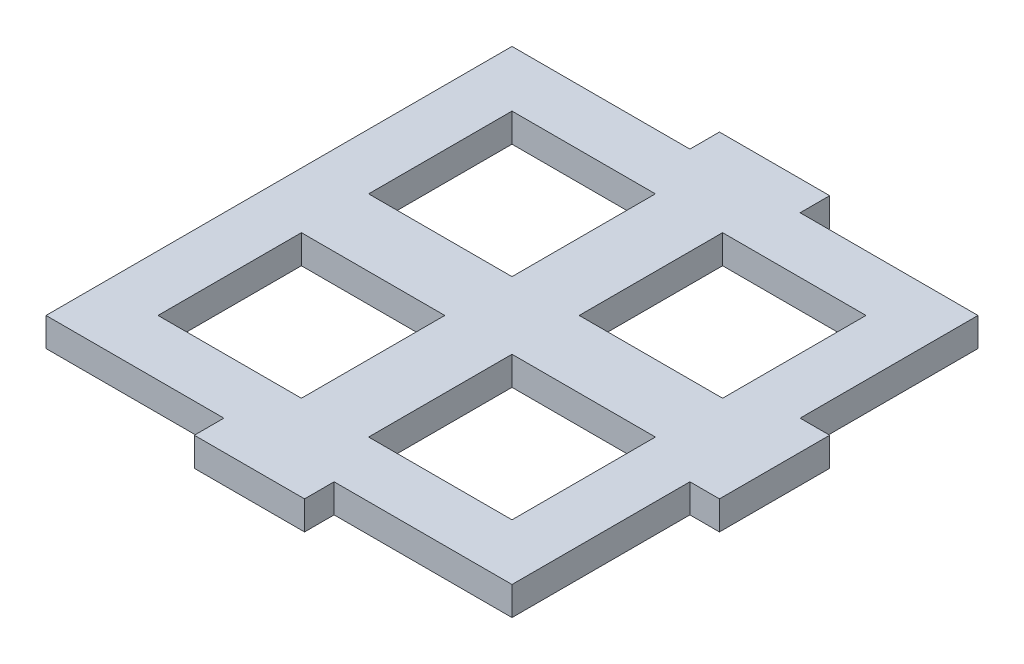
ISO-10303-21;
HEADER;
FILE_DESCRIPTION(('STEP AP214'),'2;1');
FILE_NAME('part.step','',(''),(''),'','','');
FILE_SCHEMA(('AUTOMOTIVE_DESIGN { 1 0 10303 214 1 1 1 1 }'));
ENDSEC;
DATA;
#1=APPLICATION_CONTEXT('core data for automotive mechanical design processes');
#2=APPLICATION_PROTOCOL_DEFINITION('international standard','automotive_design',2000,#1);
#3=PRODUCT_CONTEXT('',#1,'mechanical');
#4=PRODUCT('Part','Part','',(#3));
#5=PRODUCT_RELATED_PRODUCT_CATEGORY('part','',(#4));
#6=PRODUCT_DEFINITION_FORMATION('','',#4);
#7=PRODUCT_DEFINITION_CONTEXT('part definition',#1,'design');
#8=PRODUCT_DEFINITION('design','',#6,#7);
#9=PRODUCT_DEFINITION_SHAPE('','',#8);
#10=(LENGTH_UNIT() NAMED_UNIT(*) SI_UNIT(.MILLI.,.METRE.));
#11=(NAMED_UNIT(*) PLANE_ANGLE_UNIT() SI_UNIT($,.RADIAN.));
#12=(NAMED_UNIT(*) SI_UNIT($,.STERADIAN.) SOLID_ANGLE_UNIT());
#13=UNCERTAINTY_MEASURE_WITH_UNIT(LENGTH_MEASURE(1.E-05),#10,'distance_accuracy_value','');
#14=(GEOMETRIC_REPRESENTATION_CONTEXT(3) GLOBAL_UNCERTAINTY_ASSIGNED_CONTEXT((#13)) GLOBAL_UNIT_ASSIGNED_CONTEXT((#10,
#11,#12)) REPRESENTATION_CONTEXT('',''));
#15=CARTESIAN_POINT('',(0.,0.,0.));
#16=DIRECTION('',(0.,0.,1.));
#17=DIRECTION('',(1.,0.,0.));
#18=AXIS2_PLACEMENT_3D('',#15,#16,#17);
#19=CARTESIAN_POINT('',(21.016,0.,152.654));
#20=DIRECTION('',(0.,0.,1.));
#21=DIRECTION('',(1.,0.,0.));
#22=AXIS2_PLACEMENT_3D('',#19,#20,#21);
#23=PLANE('',#22);
#24=DIRECTION('',(1.,0.,0.));
#25=VECTOR('',#24,1.);
#26=CARTESIAN_POINT('',(21.016,4.064,152.654));
#27=LINE('',#26,#25);
#28=CARTESIAN_POINT('',(61.8464999999999,4.064,152.654));
#29=VERTEX_POINT('',#28);
#30=CARTESIAN_POINT('',(87.056,4.064,152.654));
#31=VERTEX_POINT('',#30);
#32=EDGE_CURVE('E478',#29,#31,#27,.T.);
#33=ORIENTED_EDGE('',*,*,#32,.F.);
#34=DIRECTION('',(0.,-1.,0.));
#35=VECTOR('',#34,1.);
#36=CARTESIAN_POINT('',(61.8464999999999,20.2374387809148,152.654));
#37=LINE('',#36,#35);
#38=CARTESIAN_POINT('',(61.8465,0.,152.654));
#39=VERTEX_POINT('',#38);
#40=EDGE_CURVE('E278',#29,#39,#37,.T.);
#41=ORIENTED_EDGE('',*,*,#40,.T.);
#42=DIRECTION('',(1.,0.,0.));
#43=VECTOR('',#42,1.);
#44=CARTESIAN_POINT('',(21.016,0.,152.654));
#45=LINE('',#44,#43);
#46=CARTESIAN_POINT('',(87.056,0.,152.654));
#47=VERTEX_POINT('',#46);
#48=EDGE_CURVE('E464',#39,#47,#45,.T.);
#49=ORIENTED_EDGE('',*,*,#48,.T.);
#50=DIRECTION('',(0.,1.,0.));
#51=VECTOR('',#50,1.);
#52=CARTESIAN_POINT('',(87.056,0.,152.654));
#53=LINE('',#52,#51);
#54=EDGE_CURVE('E488',#47,#31,#53,.T.);
#55=ORIENTED_EDGE('',*,*,#54,.T.);
#56=EDGE_LOOP('',(#33,#41,#49,#55));
#57=FACE_BOUND('',#56,.T.);
#58=ADVANCED_FACE('F34',(#57),#23,.T.);
#59=CARTESIAN_POINT('',(21.016,0.,86.614));
#60=DIRECTION('',(0.,0.,-1.));
#61=DIRECTION('',(-1.,0.,0.));
#62=AXIS2_PLACEMENT_3D('',#59,#60,#61);
#63=PLANE('',#62);
#64=DIRECTION('',(-1.,0.,0.));
#65=VECTOR('',#64,1.);
#66=CARTESIAN_POINT('',(21.016,4.064,86.614));
#67=LINE('',#66,#65);
#68=CARTESIAN_POINT('',(46.2255,4.064,86.614));
#69=VERTEX_POINT('',#68);
#70=CARTESIAN_POINT('',(21.016,4.064,86.614));
#71=VERTEX_POINT('',#70);
#72=EDGE_CURVE('E484',#69,#71,#67,.T.);
#73=ORIENTED_EDGE('',*,*,#72,.F.);
#74=DIRECTION('',(0.,-1.,0.));
#75=VECTOR('',#74,1.);
#76=CARTESIAN_POINT('',(46.2255,20.2374387809148,86.614));
#77=LINE('',#76,#75);
#78=CARTESIAN_POINT('',(46.2255,0.,86.614));
#79=VERTEX_POINT('',#78);
#80=EDGE_CURVE('E287',#69,#79,#77,.T.);
#81=ORIENTED_EDGE('',*,*,#80,.T.);
#82=DIRECTION('',(-1.,0.,0.));
#83=VECTOR('',#82,1.);
#84=CARTESIAN_POINT('',(21.016,0.,86.614));
#85=LINE('',#84,#83);
#86=CARTESIAN_POINT('',(21.016,0.,86.614));
#87=VERTEX_POINT('',#86);
#88=EDGE_CURVE('E473',#79,#87,#85,.T.);
#89=ORIENTED_EDGE('',*,*,#88,.T.);
#90=DIRECTION('',(0.,1.,0.));
#91=VECTOR('',#90,1.);
#92=CARTESIAN_POINT('',(21.016,0.,86.614));
#93=LINE('',#92,#91);
#94=EDGE_CURVE('E11',#87,#71,#93,.T.);
#95=ORIENTED_EDGE('',*,*,#94,.T.);
#96=EDGE_LOOP('',(#73,#81,#89,#95));
#97=FACE_BOUND('',#96,.T.);
#98=ADVANCED_FACE('F503',(#97),#63,.T.);
#99=CARTESIAN_POINT('',(87.056,0.,86.614));
#100=DIRECTION('',(1.,0.,0.));
#101=DIRECTION('',(0.,0.,-1.));
#102=AXIS2_PLACEMENT_3D('',#99,#100,#101);
#103=PLANE('',#102);
#104=DIRECTION('',(0.,0.,-1.));
#105=VECTOR('',#104,1.);
#106=CARTESIAN_POINT('',(87.056,4.064,86.614));
#107=LINE('',#106,#105);
#108=CARTESIAN_POINT('',(87.0559999999999,4.064,111.8235));
#109=VERTEX_POINT('',#108);
#110=CARTESIAN_POINT('',(87.056,4.064,86.614));
#111=VERTEX_POINT('',#110);
#112=EDGE_CURVE('E480',#109,#111,#107,.T.);
#113=ORIENTED_EDGE('',*,*,#112,.F.);
#114=DIRECTION('',(0.,-1.,0.));
#115=VECTOR('',#114,1.);
#116=CARTESIAN_POINT('',(87.0559999999999,20.2374387809148,111.8235));
#117=LINE('',#116,#115);
#118=CARTESIAN_POINT('',(87.056,0.,111.8235));
#119=VERTEX_POINT('',#118);
#120=EDGE_CURVE('E326',#109,#119,#117,.T.);
#121=ORIENTED_EDGE('',*,*,#120,.T.);
#122=DIRECTION('',(0.,0.,-1.));
#123=VECTOR('',#122,1.);
#124=CARTESIAN_POINT('',(87.056,0.,86.614));
#125=LINE('',#124,#123);
#126=CARTESIAN_POINT('',(87.056,0.,86.614));
#127=VERTEX_POINT('',#126);
#128=EDGE_CURVE('E469',#119,#127,#125,.T.);
#129=ORIENTED_EDGE('',*,*,#128,.T.);
#130=DIRECTION('',(0.,1.,0.));
#131=VECTOR('',#130,1.);
#132=CARTESIAN_POINT('',(87.056,0.,86.614));
#133=LINE('',#132,#131);
#134=EDGE_CURVE('E43',#127,#111,#133,.T.);
#135=ORIENTED_EDGE('',*,*,#134,.T.);
#136=EDGE_LOOP('',(#113,#121,#129,#135));
#137=FACE_BOUND('',#136,.T.);
#138=ADVANCED_FACE('F523',(#137),#103,.T.);
#139=CARTESIAN_POINT('',(21.016,0.,86.614));
#140=DIRECTION('',(-1.,0.,0.));
#141=DIRECTION('',(0.,0.,1.));
#142=AXIS2_PLACEMENT_3D('',#139,#140,#141);
#143=PLANE('',#142);
#144=DIRECTION('',(0.,0.,1.));
#145=VECTOR('',#144,1.);
#146=CARTESIAN_POINT('',(21.016,4.064,86.614));
#147=LINE('',#146,#145);
#148=CARTESIAN_POINT('',(21.016,4.064,152.654));
#149=VERTEX_POINT('',#148);
#150=EDGE_CURVE('E454',#71,#149,#147,.T.);
#151=ORIENTED_EDGE('',*,*,#150,.F.);
#152=ORIENTED_EDGE('',*,*,#94,.F.);
#153=DIRECTION('',(0.,0.,1.));
#154=VECTOR('',#153,1.);
#155=CARTESIAN_POINT('',(21.016,0.,86.614));
#156=LINE('',#155,#154);
#157=CARTESIAN_POINT('',(21.016,0.,152.654));
#158=VERTEX_POINT('',#157);
#159=EDGE_CURVE('E461',#87,#158,#156,.T.);
#160=ORIENTED_EDGE('',*,*,#159,.T.);
#161=DIRECTION('',(0.,1.,0.));
#162=VECTOR('',#161,1.);
#163=CARTESIAN_POINT('',(21.016,0.,152.654));
#164=LINE('',#163,#162);
#165=EDGE_CURVE('E38',#158,#149,#164,.T.);
#166=ORIENTED_EDGE('',*,*,#165,.T.);
#167=EDGE_LOOP('',(#151,#152,#160,#166));
#168=FACE_BOUND('',#167,.T.);
#169=ADVANCED_FACE('F36',(#168),#143,.T.);
#170=DIRECTION('',(0.,-1.,0.));
#171=VECTOR('',#170,1.);
#172=CARTESIAN_POINT('',(61.8465,20.2374387809148,86.614));
#173=LINE('',#172,#171);
#174=CARTESIAN_POINT('',(61.8465,4.064,86.614));
#175=VERTEX_POINT('',#174);
#176=CARTESIAN_POINT('',(61.8465,0.,86.614));
#177=VERTEX_POINT('',#176);
#178=EDGE_CURVE('E293',#175,#177,#173,.T.);
#179=ORIENTED_EDGE('',*,*,#178,.F.);
#180=EDGE_CURVE('E465',#111,#175,#67,.T.);
#181=ORIENTED_EDGE('',*,*,#180,.F.);
#182=ORIENTED_EDGE('',*,*,#134,.F.);
#183=EDGE_CURVE('E474',#127,#177,#85,.T.);
#184=ORIENTED_EDGE('',*,*,#183,.T.);
#185=EDGE_LOOP('',(#179,#181,#182,#184));
#186=FACE_BOUND('',#185,.T.);
#187=ADVANCED_FACE('F525',(#186),#63,.T.);
#188=DIRECTION('',(0.,-1.,0.));
#189=VECTOR('',#188,1.);
#190=CARTESIAN_POINT('',(87.0559999999999,20.2374387809148,127.4445));
#191=LINE('',#190,#189);
#192=CARTESIAN_POINT('',(87.0559999999999,4.064,127.4445));
#193=VERTEX_POINT('',#192);
#194=CARTESIAN_POINT('',(87.0559999999999,0.,127.4445));
#195=VERTEX_POINT('',#194);
#196=EDGE_CURVE('E317',#193,#195,#191,.T.);
#197=ORIENTED_EDGE('',*,*,#196,.F.);
#198=EDGE_CURVE('E481',#31,#193,#107,.T.);
#199=ORIENTED_EDGE('',*,*,#198,.F.);
#200=ORIENTED_EDGE('',*,*,#54,.F.);
#201=EDGE_CURVE('E470',#47,#195,#125,.T.);
#202=ORIENTED_EDGE('',*,*,#201,.T.);
#203=EDGE_LOOP('',(#197,#199,#200,#202));
#204=FACE_BOUND('',#203,.T.);
#205=ADVANCED_FACE('F511',(#204),#103,.T.);
#206=DIRECTION('',(0.,-1.,0.));
#207=VECTOR('',#206,1.);
#208=CARTESIAN_POINT('',(46.2255,20.2374387809148,152.654));
#209=LINE('',#208,#207);
#210=CARTESIAN_POINT('',(46.2255,4.064,152.654));
#211=VERTEX_POINT('',#210);
#212=CARTESIAN_POINT('',(46.2255,0.,152.654));
#213=VERTEX_POINT('',#212);
#214=EDGE_CURVE('E257',#211,#213,#209,.T.);
#215=ORIENTED_EDGE('',*,*,#214,.F.);
#216=EDGE_CURVE('E254',#149,#211,#27,.T.);
#217=ORIENTED_EDGE('',*,*,#216,.F.);
#218=ORIENTED_EDGE('',*,*,#165,.F.);
#219=EDGE_CURVE('E466',#158,#213,#45,.T.);
#220=ORIENTED_EDGE('',*,*,#219,.T.);
#221=EDGE_LOOP('',(#215,#217,#218,#220));
#222=FACE_BOUND('',#221,.T.);
#223=ADVANCED_FACE('F500',(#222),#23,.T.);
#224=CARTESIAN_POINT('',(0.,0.,0.));
#225=DIRECTION('',(0.,1.,0.));
#226=DIRECTION('',(0.,0.,1.));
#227=AXIS2_PLACEMENT_3D('',#224,#225,#226);
#228=PLANE('',#227);
#229=DIRECTION('',(1.,0.,0.));
#230=VECTOR('',#229,1.);
#231=CARTESIAN_POINT('',(58.7984999999999,0.,144.7165));
#232=LINE('',#231,#230);
#233=CARTESIAN_POINT('',(58.7984999999999,0.,144.7165));
#234=VERTEX_POINT('',#233);
#235=CARTESIAN_POINT('',(79.1185,0.,144.7165));
#236=VERTEX_POINT('',#235);
#237=EDGE_CURVE('E343',#234,#236,#232,.T.);
#238=ORIENTED_EDGE('',*,*,#237,.T.);
#239=DIRECTION('',(0.,0.,-1.));
#240=VECTOR('',#239,1.);
#241=CARTESIAN_POINT('',(79.1184999999999,0.,124.3965));
#242=LINE('',#241,#240);
#243=CARTESIAN_POINT('',(79.1184999999999,0.,124.3965));
#244=VERTEX_POINT('',#243);
#245=EDGE_CURVE('E333',#236,#244,#242,.T.);
#246=ORIENTED_EDGE('',*,*,#245,.T.);
#247=DIRECTION('',(-1.,0.,0.));
#248=VECTOR('',#247,1.);
#249=CARTESIAN_POINT('',(58.7984999999999,0.,124.3965));
#250=LINE('',#249,#248);
#251=CARTESIAN_POINT('',(58.7984999999999,0.,124.3965));
#252=VERTEX_POINT('',#251);
#253=EDGE_CURVE('E336',#244,#252,#250,.T.);
#254=ORIENTED_EDGE('',*,*,#253,.T.);
#255=DIRECTION('',(0.,0.,1.));
#256=VECTOR('',#255,1.);
#257=CARTESIAN_POINT('',(58.7984999999999,0.,124.3965));
#258=LINE('',#257,#256);
#259=EDGE_CURVE('E340',#252,#234,#258,.T.);
#260=ORIENTED_EDGE('',*,*,#259,.T.);
#261=EDGE_LOOP('',(#238,#246,#254,#260));
#262=FACE_BOUND('',#261,.T.);
#263=DIRECTION('',(1.,0.,0.));
#264=VECTOR('',#263,1.);
#265=CARTESIAN_POINT('',(28.9534999999999,0.,144.7165));
#266=LINE('',#265,#264);
#267=CARTESIAN_POINT('',(28.9534999999999,0.,144.7165));
#268=VERTEX_POINT('',#267);
#269=CARTESIAN_POINT('',(49.2735,0.,144.7165));
#270=VERTEX_POINT('',#269);
#271=EDGE_CURVE('E375',#268,#270,#266,.T.);
#272=ORIENTED_EDGE('',*,*,#271,.T.);
#273=DIRECTION('',(0.,0.,-1.));
#274=VECTOR('',#273,1.);
#275=CARTESIAN_POINT('',(49.2734999999999,0.,124.3965));
#276=LINE('',#275,#274);
#277=CARTESIAN_POINT('',(49.2734999999999,0.,124.3965));
#278=VERTEX_POINT('',#277);
#279=EDGE_CURVE('E365',#270,#278,#276,.T.);
#280=ORIENTED_EDGE('',*,*,#279,.T.);
#281=DIRECTION('',(-1.,0.,0.));
#282=VECTOR('',#281,1.);
#283=CARTESIAN_POINT('',(28.9534999999999,0.,124.3965));
#284=LINE('',#283,#282);
#285=CARTESIAN_POINT('',(28.9534999999999,0.,124.3965));
#286=VERTEX_POINT('',#285);
#287=EDGE_CURVE('E368',#278,#286,#284,.T.);
#288=ORIENTED_EDGE('',*,*,#287,.T.);
#289=DIRECTION('',(0.,0.,1.));
#290=VECTOR('',#289,1.);
#291=CARTESIAN_POINT('',(28.9534999999999,0.,124.3965));
#292=LINE('',#291,#290);
#293=EDGE_CURVE('E372',#286,#268,#292,.T.);
#294=ORIENTED_EDGE('',*,*,#293,.T.);
#295=EDGE_LOOP('',(#272,#280,#288,#294));
#296=FACE_BOUND('',#295,.T.);
#297=DIRECTION('',(1.,0.,0.));
#298=VECTOR('',#297,1.);
#299=CARTESIAN_POINT('',(58.7984999999999,0.,114.8715));
#300=LINE('',#299,#298);
#301=CARTESIAN_POINT('',(58.7984999999999,0.,114.8715));
#302=VERTEX_POINT('',#301);
#303=CARTESIAN_POINT('',(79.1184999999999,0.,114.8715));
#304=VERTEX_POINT('',#303);
#305=EDGE_CURVE('E407',#302,#304,#300,.T.);
#306=ORIENTED_EDGE('',*,*,#305,.T.);
#307=DIRECTION('',(0.,0.,-1.));
#308=VECTOR('',#307,1.);
#309=CARTESIAN_POINT('',(79.1184999999999,0.,94.5514999999999));
#310=LINE('',#309,#308);
#311=CARTESIAN_POINT('',(79.1184999999999,0.,94.5514999999999));
#312=VERTEX_POINT('',#311);
#313=EDGE_CURVE('E397',#304,#312,#310,.T.);
#314=ORIENTED_EDGE('',*,*,#313,.T.);
#315=DIRECTION('',(-1.,0.,0.));
#316=VECTOR('',#315,1.);
#317=CARTESIAN_POINT('',(58.7984999999999,0.,94.5514999999999));
#318=LINE('',#317,#316);
#319=CARTESIAN_POINT('',(58.7984999999999,0.,94.5514999999999));
#320=VERTEX_POINT('',#319);
#321=EDGE_CURVE('E400',#312,#320,#318,.T.);
#322=ORIENTED_EDGE('',*,*,#321,.T.);
#323=DIRECTION('',(0.,0.,1.));
#324=VECTOR('',#323,1.);
#325=CARTESIAN_POINT('',(58.7984999999999,0.,94.5514999999999));
#326=LINE('',#325,#324);
#327=EDGE_CURVE('E404',#320,#302,#326,.T.);
#328=ORIENTED_EDGE('',*,*,#327,.T.);
#329=EDGE_LOOP('',(#306,#314,#322,#328));
#330=FACE_BOUND('',#329,.T.);
#331=DIRECTION('',(-1.,0.,0.));
#332=VECTOR('',#331,1.);
#333=CARTESIAN_POINT('',(49.2734999999999,0.,94.5514999999999));
#334=LINE('',#333,#332);
#335=CARTESIAN_POINT('',(49.2734999999999,0.,94.5514999999999));
#336=VERTEX_POINT('',#335);
#337=CARTESIAN_POINT('',(28.9534999999999,0.,94.5514999999999));
#338=VERTEX_POINT('',#337);
#339=EDGE_CURVE('E439',#336,#338,#334,.T.);
#340=ORIENTED_EDGE('',*,*,#339,.T.);
#341=DIRECTION('',(0.,0.,1.));
#342=VECTOR('',#341,1.);
#343=CARTESIAN_POINT('',(28.9534999999999,0.,94.5514999999999));
#344=LINE('',#343,#342);
#345=CARTESIAN_POINT('',(28.9534999999999,0.,114.8715));
#346=VERTEX_POINT('',#345);
#347=EDGE_CURVE('E429',#338,#346,#344,.T.);
#348=ORIENTED_EDGE('',*,*,#347,.T.);
#349=DIRECTION('',(1.,0.,0.));
#350=VECTOR('',#349,1.);
#351=CARTESIAN_POINT('',(49.2734999999999,0.,114.8715));
#352=LINE('',#351,#350);
#353=CARTESIAN_POINT('',(49.2734999999999,0.,114.8715));
#354=VERTEX_POINT('',#353);
#355=EDGE_CURVE('E432',#346,#354,#352,.T.);
#356=ORIENTED_EDGE('',*,*,#355,.T.);
#357=DIRECTION('',(0.,0.,-1.));
#358=VECTOR('',#357,1.);
#359=CARTESIAN_POINT('',(49.2734999999999,0.,94.5514999999999));
#360=LINE('',#359,#358);
#361=EDGE_CURVE('E436',#354,#336,#360,.T.);
#362=ORIENTED_EDGE('',*,*,#361,.T.);
#363=EDGE_LOOP('',(#340,#348,#356,#362));
#364=FACE_BOUND('',#363,.T.);
#365=ORIENTED_EDGE('',*,*,#159,.F.);
#366=ORIENTED_EDGE('',*,*,#88,.F.);
#367=DIRECTION('',(0.,0.,-1.));
#368=VECTOR('',#367,1.);
#369=CARTESIAN_POINT('',(46.2255,0.,82.423));
#370=LINE('',#369,#368);
#371=CARTESIAN_POINT('',(46.2255,0.,82.423));
#372=VERTEX_POINT('',#371);
#373=EDGE_CURVE('E59',#79,#372,#370,.T.);
#374=ORIENTED_EDGE('',*,*,#373,.T.);
#375=DIRECTION('',(1.,0.,0.));
#376=VECTOR('',#375,1.);
#377=CARTESIAN_POINT('',(61.8465,0.,82.423));
#378=LINE('',#377,#376);
#379=CARTESIAN_POINT('',(61.8465,0.,82.423));
#380=VERTEX_POINT('',#379);
#381=EDGE_CURVE('E284',#372,#380,#378,.T.);
#382=ORIENTED_EDGE('',*,*,#381,.T.);
#383=DIRECTION('',(0.,0.,1.));
#384=VECTOR('',#383,1.);
#385=CARTESIAN_POINT('',(61.8465,0.,82.423));
#386=LINE('',#385,#384);
#387=EDGE_CURVE('E283',#380,#177,#386,.T.);
#388=ORIENTED_EDGE('',*,*,#387,.T.);
#389=ORIENTED_EDGE('',*,*,#183,.F.);
#390=ORIENTED_EDGE('',*,*,#128,.F.);
#391=DIRECTION('',(1.,0.,0.));
#392=VECTOR('',#391,1.);
#393=CARTESIAN_POINT('',(91.2469999999999,0.,111.8235));
#394=LINE('',#393,#392);
#395=CARTESIAN_POINT('',(91.2469999999999,0.,111.8235));
#396=VERTEX_POINT('',#395);
#397=EDGE_CURVE('E307',#119,#396,#394,.T.);
#398=ORIENTED_EDGE('',*,*,#397,.T.);
#399=DIRECTION('',(0.,0.,1.));
#400=VECTOR('',#399,1.);
#401=CARTESIAN_POINT('',(91.2469999999999,0.,111.8235));
#402=LINE('',#401,#400);
#403=CARTESIAN_POINT('',(91.2469999999999,0.,127.4445));
#404=VERTEX_POINT('',#403);
#405=EDGE_CURVE('E306',#396,#404,#402,.T.);
#406=ORIENTED_EDGE('',*,*,#405,.T.);
#407=DIRECTION('',(-1.,0.,0.));
#408=VECTOR('',#407,1.);
#409=CARTESIAN_POINT('',(91.2469999999999,0.,127.4445));
#410=LINE('',#409,#408);
#411=EDGE_CURVE('E311',#404,#195,#410,.T.);
#412=ORIENTED_EDGE('',*,*,#411,.T.);
#413=ORIENTED_EDGE('',*,*,#201,.F.);
#414=ORIENTED_EDGE('',*,*,#48,.F.);
#415=DIRECTION('',(0.,0.,1.));
#416=VECTOR('',#415,1.);
#417=CARTESIAN_POINT('',(61.8464999999999,0.,152.654));
#418=LINE('',#417,#416);
#419=CARTESIAN_POINT('',(61.8465,0.,156.845));
#420=VERTEX_POINT('',#419);
#421=EDGE_CURVE('E51',#39,#420,#418,.T.);
#422=ORIENTED_EDGE('',*,*,#421,.T.);
#423=DIRECTION('',(-1.,0.,0.));
#424=VECTOR('',#423,1.);
#425=CARTESIAN_POINT('',(61.8465,0.,156.845));
#426=LINE('',#425,#424);
#427=CARTESIAN_POINT('',(46.2255,0.,156.845));
#428=VERTEX_POINT('',#427);
#429=EDGE_CURVE('E272',#420,#428,#426,.T.);
#430=ORIENTED_EDGE('',*,*,#429,.T.);
#431=DIRECTION('',(0.,0.,-1.));
#432=VECTOR('',#431,1.);
#433=CARTESIAN_POINT('',(46.2255,0.,152.654));
#434=LINE('',#433,#432);
#435=EDGE_CURVE('E263',#428,#213,#434,.T.);
#436=ORIENTED_EDGE('',*,*,#435,.T.);
#437=ORIENTED_EDGE('',*,*,#219,.F.);
#438=EDGE_LOOP('',(#365,#366,#374,#382,#388,#389,#390,#398,#406,#412,#413,#414,#422,#430,#436,#437));
#439=FACE_BOUND('',#438,.T.);
#440=ADVANCED_FACE('F506',(#262,#296,#330,#364,#439),#228,.F.);
#441=CARTESIAN_POINT('',(0.,4.064,0.));
#442=DIRECTION('',(0.,1.,0.));
#443=DIRECTION('',(0.,0.,1.));
#444=AXIS2_PLACEMENT_3D('',#441,#442,#443);
#445=PLANE('',#444);
#446=DIRECTION('',(0.,0.,-1.));
#447=VECTOR('',#446,1.);
#448=CARTESIAN_POINT('',(79.1184999999999,4.064,124.3965));
#449=LINE('',#448,#447);
#450=CARTESIAN_POINT('',(79.1185,4.064,144.7165));
#451=VERTEX_POINT('',#450);
#452=CARTESIAN_POINT('',(79.1184999999999,4.064,124.3965));
#453=VERTEX_POINT('',#452);
#454=EDGE_CURVE('E332',#451,#453,#449,.T.);
#455=ORIENTED_EDGE('',*,*,#454,.F.);
#456=DIRECTION('',(1.,0.,0.));
#457=VECTOR('',#456,1.);
#458=CARTESIAN_POINT('',(58.7984999999999,4.064,144.7165));
#459=LINE('',#458,#457);
#460=CARTESIAN_POINT('',(58.7984999999999,4.064,144.7165));
#461=VERTEX_POINT('',#460);
#462=EDGE_CURVE('E337',#461,#451,#459,.T.);
#463=ORIENTED_EDGE('',*,*,#462,.F.);
#464=DIRECTION('',(0.,0.,1.));
#465=VECTOR('',#464,1.);
#466=CARTESIAN_POINT('',(58.7984999999999,4.064,124.3965));
#467=LINE('',#466,#465);
#468=CARTESIAN_POINT('',(58.7984999999999,4.064,124.3965));
#469=VERTEX_POINT('',#468);
#470=EDGE_CURVE('E351',#469,#461,#467,.T.);
#471=ORIENTED_EDGE('',*,*,#470,.F.);
#472=DIRECTION('',(-1.,0.,0.));
#473=VECTOR('',#472,1.);
#474=CARTESIAN_POINT('',(58.7984999999999,4.064,124.3965));
#475=LINE('',#474,#473);
#476=EDGE_CURVE('E348',#453,#469,#475,.T.);
#477=ORIENTED_EDGE('',*,*,#476,.F.);
#478=EDGE_LOOP('',(#455,#463,#471,#477));
#479=FACE_BOUND('',#478,.T.);
#480=DIRECTION('',(0.,0.,-1.));
#481=VECTOR('',#480,1.);
#482=CARTESIAN_POINT('',(49.2734999999999,4.064,124.3965));
#483=LINE('',#482,#481);
#484=CARTESIAN_POINT('',(49.2735,4.064,144.7165));
#485=VERTEX_POINT('',#484);
#486=CARTESIAN_POINT('',(49.2734999999999,4.064,124.3965));
#487=VERTEX_POINT('',#486);
#488=EDGE_CURVE('E358',#485,#487,#483,.T.);
#489=ORIENTED_EDGE('',*,*,#488,.F.);
#490=DIRECTION('',(1.,0.,0.));
#491=VECTOR('',#490,1.);
#492=CARTESIAN_POINT('',(28.9534999999999,4.064,144.7165));
#493=LINE('',#492,#491);
#494=CARTESIAN_POINT('',(28.9534999999999,4.064,144.7165));
#495=VERTEX_POINT('',#494);
#496=EDGE_CURVE('E369',#495,#485,#493,.T.);
#497=ORIENTED_EDGE('',*,*,#496,.F.);
#498=DIRECTION('',(0.,0.,1.));
#499=VECTOR('',#498,1.);
#500=CARTESIAN_POINT('',(28.9534999999999,4.064,124.3965));
#501=LINE('',#500,#499);
#502=CARTESIAN_POINT('',(28.9534999999999,4.064,124.3965));
#503=VERTEX_POINT('',#502);
#504=EDGE_CURVE('E383',#503,#495,#501,.T.);
#505=ORIENTED_EDGE('',*,*,#504,.F.);
#506=DIRECTION('',(-1.,0.,0.));
#507=VECTOR('',#506,1.);
#508=CARTESIAN_POINT('',(28.9534999999999,4.064,124.3965));
#509=LINE('',#508,#507);
#510=EDGE_CURVE('E380',#487,#503,#509,.T.);
#511=ORIENTED_EDGE('',*,*,#510,.F.);
#512=EDGE_LOOP('',(#489,#497,#505,#511));
#513=FACE_BOUND('',#512,.T.);
#514=DIRECTION('',(0.,0.,-1.));
#515=VECTOR('',#514,1.);
#516=CARTESIAN_POINT('',(79.1184999999999,4.064,94.5514999999999));
#517=LINE('',#516,#515);
#518=CARTESIAN_POINT('',(79.1184999999999,4.064,114.8715));
#519=VERTEX_POINT('',#518);
#520=CARTESIAN_POINT('',(79.1184999999999,4.064,94.5514999999999));
#521=VERTEX_POINT('',#520);
#522=EDGE_CURVE('E390',#519,#521,#517,.T.);
#523=ORIENTED_EDGE('',*,*,#522,.F.);
#524=DIRECTION('',(1.,0.,0.));
#525=VECTOR('',#524,1.);
#526=CARTESIAN_POINT('',(58.7984999999999,4.064,114.8715));
#527=LINE('',#526,#525);
#528=CARTESIAN_POINT('',(58.7984999999999,4.064,114.8715));
#529=VERTEX_POINT('',#528);
#530=EDGE_CURVE('E401',#529,#519,#527,.T.);
#531=ORIENTED_EDGE('',*,*,#530,.F.);
#532=DIRECTION('',(0.,0.,1.));
#533=VECTOR('',#532,1.);
#534=CARTESIAN_POINT('',(58.7984999999999,4.064,94.5514999999999));
#535=LINE('',#534,#533);
#536=CARTESIAN_POINT('',(58.7984999999999,4.064,94.5514999999999));
#537=VERTEX_POINT('',#536);
#538=EDGE_CURVE('E415',#537,#529,#535,.T.);
#539=ORIENTED_EDGE('',*,*,#538,.F.);
#540=DIRECTION('',(-1.,0.,0.));
#541=VECTOR('',#540,1.);
#542=CARTESIAN_POINT('',(58.7984999999999,4.064,94.5514999999999));
#543=LINE('',#542,#541);
#544=EDGE_CURVE('E412',#521,#537,#543,.T.);
#545=ORIENTED_EDGE('',*,*,#544,.F.);
#546=EDGE_LOOP('',(#523,#531,#539,#545));
#547=FACE_BOUND('',#546,.T.);
#548=DIRECTION('',(0.,0.,1.));
#549=VECTOR('',#548,1.);
#550=CARTESIAN_POINT('',(28.9534999999999,4.064,94.5514999999999));
#551=LINE('',#550,#549);
#552=CARTESIAN_POINT('',(28.9534999999999,4.064,94.5514999999999));
#553=VERTEX_POINT('',#552);
#554=CARTESIAN_POINT('',(28.9534999999999,4.064,114.8715));
#555=VERTEX_POINT('',#554);
#556=EDGE_CURVE('E422',#553,#555,#551,.T.);
#557=ORIENTED_EDGE('',*,*,#556,.F.);
#558=DIRECTION('',(-1.,0.,0.));
#559=VECTOR('',#558,1.);
#560=CARTESIAN_POINT('',(49.2734999999999,4.064,94.5514999999999));
#561=LINE('',#560,#559);
#562=CARTESIAN_POINT('',(49.2734999999999,4.064,94.5514999999999));
#563=VERTEX_POINT('',#562);
#564=EDGE_CURVE('E433',#563,#553,#561,.T.);
#565=ORIENTED_EDGE('',*,*,#564,.F.);
#566=DIRECTION('',(0.,0.,-1.));
#567=VECTOR('',#566,1.);
#568=CARTESIAN_POINT('',(49.2734999999999,4.064,94.5514999999999));
#569=LINE('',#568,#567);
#570=CARTESIAN_POINT('',(49.2734999999999,4.064,114.8715));
#571=VERTEX_POINT('',#570);
#572=EDGE_CURVE('E447',#571,#563,#569,.T.);
#573=ORIENTED_EDGE('',*,*,#572,.F.);
#574=DIRECTION('',(1.,0.,0.));
#575=VECTOR('',#574,1.);
#576=CARTESIAN_POINT('',(49.2734999999999,4.064,114.8715));
#577=LINE('',#576,#575);
#578=EDGE_CURVE('E444',#555,#571,#577,.T.);
#579=ORIENTED_EDGE('',*,*,#578,.F.);
#580=EDGE_LOOP('',(#557,#565,#573,#579));
#581=FACE_BOUND('',#580,.T.);
#582=ORIENTED_EDGE('',*,*,#150,.T.);
#583=ORIENTED_EDGE('',*,*,#216,.T.);
#584=DIRECTION('',(0.,0.,-1.));
#585=VECTOR('',#584,1.);
#586=CARTESIAN_POINT('',(46.2255,4.064,152.654));
#587=LINE('',#586,#585);
#588=CARTESIAN_POINT('',(46.2255,4.064,156.845));
#589=VERTEX_POINT('',#588);
#590=EDGE_CURVE('E246',#589,#211,#587,.T.);
#591=ORIENTED_EDGE('',*,*,#590,.F.);
#592=DIRECTION('',(-1.,0.,0.));
#593=VECTOR('',#592,1.);
#594=CARTESIAN_POINT('',(61.8465,4.064,156.845));
#595=LINE('',#594,#593);
#596=CARTESIAN_POINT('',(61.8465,4.064,156.845));
#597=VERTEX_POINT('',#596);
#598=EDGE_CURVE('E251',#597,#589,#595,.T.);
#599=ORIENTED_EDGE('',*,*,#598,.F.);
#600=DIRECTION('',(0.,0.,1.));
#601=VECTOR('',#600,1.);
#602=CARTESIAN_POINT('',(61.8464999999999,4.064,152.654));
#603=LINE('',#602,#601);
#604=EDGE_CURVE('E277',#29,#597,#603,.T.);
#605=ORIENTED_EDGE('',*,*,#604,.F.);
#606=ORIENTED_EDGE('',*,*,#32,.T.);
#607=ORIENTED_EDGE('',*,*,#198,.T.);
#608=DIRECTION('',(-1.,0.,0.));
#609=VECTOR('',#608,1.);
#610=CARTESIAN_POINT('',(91.2469999999999,4.064,127.4445));
#611=LINE('',#610,#609);
#612=CARTESIAN_POINT('',(91.2469999999999,4.064,127.4445));
#613=VERTEX_POINT('',#612);
#614=EDGE_CURVE('E310',#613,#193,#611,.T.);
#615=ORIENTED_EDGE('',*,*,#614,.F.);
#616=DIRECTION('',(0.,0.,1.));
#617=VECTOR('',#616,1.);
#618=CARTESIAN_POINT('',(91.2469999999999,4.064,111.8235));
#619=LINE('',#618,#617);
#620=CARTESIAN_POINT('',(91.2469999999999,4.064,111.8235));
#621=VERTEX_POINT('',#620);
#622=EDGE_CURVE('E318',#621,#613,#619,.T.);
#623=ORIENTED_EDGE('',*,*,#622,.F.);
#624=DIRECTION('',(1.,0.,0.));
#625=VECTOR('',#624,1.);
#626=CARTESIAN_POINT('',(91.2469999999999,4.064,111.8235));
#627=LINE('',#626,#625);
#628=EDGE_CURVE('E323',#109,#621,#627,.T.);
#629=ORIENTED_EDGE('',*,*,#628,.F.);
#630=ORIENTED_EDGE('',*,*,#112,.T.);
#631=ORIENTED_EDGE('',*,*,#180,.T.);
#632=DIRECTION('',(0.,0.,1.));
#633=VECTOR('',#632,1.);
#634=CARTESIAN_POINT('',(61.8465,4.064,82.423));
#635=LINE('',#634,#633);
#636=CARTESIAN_POINT('',(61.8465,4.064,82.423));
#637=VERTEX_POINT('',#636);
#638=EDGE_CURVE('E291',#637,#175,#635,.T.);
#639=ORIENTED_EDGE('',*,*,#638,.F.);
#640=DIRECTION('',(1.,0.,0.));
#641=VECTOR('',#640,1.);
#642=CARTESIAN_POINT('',(61.8465,4.064,82.423));
#643=LINE('',#642,#641);
#644=CARTESIAN_POINT('',(46.2255,4.064,82.423));
#645=VERTEX_POINT('',#644);
#646=EDGE_CURVE('E295',#645,#637,#643,.T.);
#647=ORIENTED_EDGE('',*,*,#646,.F.);
#648=DIRECTION('',(0.,0.,-1.));
#649=VECTOR('',#648,1.);
#650=CARTESIAN_POINT('',(46.2255,4.064,82.423));
#651=LINE('',#650,#649);
#652=EDGE_CURVE('E299',#69,#645,#651,.T.);
#653=ORIENTED_EDGE('',*,*,#652,.F.);
#654=ORIENTED_EDGE('',*,*,#72,.T.);
#655=EDGE_LOOP('',(#582,#583,#591,#599,#605,#606,#607,#615,#623,#629,#630,#631,#639,#647,#653,#654));
#656=FACE_BOUND('',#655,.T.);
#657=ADVANCED_FACE('F249',(#479,#513,#547,#581,#656),#445,.T.);
#658=CARTESIAN_POINT('',(28.9534999999999,0.,94.5514999999999));
#659=DIRECTION('',(-1.,0.,0.));
#660=DIRECTION('',(0.,0.,1.));
#661=AXIS2_PLACEMENT_3D('',#658,#659,#660);
#662=PLANE('',#661);
#663=ORIENTED_EDGE('',*,*,#556,.T.);
#664=DIRECTION('',(0.,1.,0.));
#665=VECTOR('',#664,1.);
#666=CARTESIAN_POINT('',(28.9534999999999,0.,114.8715));
#667=LINE('',#666,#665);
#668=EDGE_CURVE('E442',#346,#555,#667,.T.);
#669=ORIENTED_EDGE('',*,*,#668,.F.);
#670=ORIENTED_EDGE('',*,*,#347,.F.);
#671=DIRECTION('',(0.,1.,0.));
#672=VECTOR('',#671,1.);
#673=CARTESIAN_POINT('',(28.9534999999999,0.,94.5514999999999));
#674=LINE('',#673,#672);
#675=EDGE_CURVE('E452',#338,#553,#674,.T.);
#676=ORIENTED_EDGE('',*,*,#675,.T.);
#677=EDGE_LOOP('',(#663,#669,#670,#676));
#678=FACE_BOUND('',#677,.T.);
#679=ADVANCED_FACE('F634',(#678),#662,.F.);
#680=CARTESIAN_POINT('',(49.2734999999999,0.,94.5514999999999));
#681=DIRECTION('',(0.,0.,-1.));
#682=DIRECTION('',(-1.,0.,0.));
#683=AXIS2_PLACEMENT_3D('',#680,#681,#682);
#684=PLANE('',#683);
#685=ORIENTED_EDGE('',*,*,#564,.T.);
#686=ORIENTED_EDGE('',*,*,#675,.F.);
#687=ORIENTED_EDGE('',*,*,#339,.F.);
#688=DIRECTION('',(0.,1.,0.));
#689=VECTOR('',#688,1.);
#690=CARTESIAN_POINT('',(49.2734999999999,0.,94.5514999999999));
#691=LINE('',#690,#689);
#692=EDGE_CURVE('E455',#336,#563,#691,.T.);
#693=ORIENTED_EDGE('',*,*,#692,.T.);
#694=EDGE_LOOP('',(#685,#686,#687,#693));
#695=FACE_BOUND('',#694,.T.);
#696=ADVANCED_FACE('F630',(#695),#684,.F.);
#697=CARTESIAN_POINT('',(49.2734999999999,0.,94.5514999999999));
#698=DIRECTION('',(1.,0.,0.));
#699=DIRECTION('',(0.,0.,-1.));
#700=AXIS2_PLACEMENT_3D('',#697,#698,#699);
#701=PLANE('',#700);
#702=ORIENTED_EDGE('',*,*,#572,.T.);
#703=ORIENTED_EDGE('',*,*,#692,.F.);
#704=ORIENTED_EDGE('',*,*,#361,.F.);
#705=DIRECTION('',(0.,1.,0.));
#706=VECTOR('',#705,1.);
#707=CARTESIAN_POINT('',(49.2734999999999,0.,114.8715));
#708=LINE('',#707,#706);
#709=EDGE_CURVE('E457',#354,#571,#708,.T.);
#710=ORIENTED_EDGE('',*,*,#709,.T.);
#711=EDGE_LOOP('',(#702,#703,#704,#710));
#712=FACE_BOUND('',#711,.T.);
#713=ADVANCED_FACE('F633',(#712),#701,.F.);
#714=CARTESIAN_POINT('',(49.2734999999999,0.,114.8715));
#715=DIRECTION('',(0.,0.,1.));
#716=DIRECTION('',(1.,0.,0.));
#717=AXIS2_PLACEMENT_3D('',#714,#715,#716);
#718=PLANE('',#717);
#719=ORIENTED_EDGE('',*,*,#578,.T.);
#720=ORIENTED_EDGE('',*,*,#709,.F.);
#721=ORIENTED_EDGE('',*,*,#355,.F.);
#722=ORIENTED_EDGE('',*,*,#668,.T.);
#723=EDGE_LOOP('',(#719,#720,#721,#722));
#724=FACE_BOUND('',#723,.T.);
#725=ADVANCED_FACE('F628',(#724),#718,.F.);
#726=CARTESIAN_POINT('',(79.1184999999999,0.,94.5514999999999));
#727=DIRECTION('',(1.,0.,0.));
#728=DIRECTION('',(0.,0.,-1.));
#729=AXIS2_PLACEMENT_3D('',#726,#727,#728);
#730=PLANE('',#729);
#731=ORIENTED_EDGE('',*,*,#522,.T.);
#732=DIRECTION('',(0.,1.,0.));
#733=VECTOR('',#732,1.);
#734=CARTESIAN_POINT('',(79.1184999999999,0.,94.5514999999999));
#735=LINE('',#734,#733);
#736=EDGE_CURVE('E410',#312,#521,#735,.T.);
#737=ORIENTED_EDGE('',*,*,#736,.F.);
#738=ORIENTED_EDGE('',*,*,#313,.F.);
#739=DIRECTION('',(0.,1.,0.));
#740=VECTOR('',#739,1.);
#741=CARTESIAN_POINT('',(79.1184999999999,0.,114.8715));
#742=LINE('',#741,#740);
#743=EDGE_CURVE('E420',#304,#519,#742,.T.);
#744=ORIENTED_EDGE('',*,*,#743,.T.);
#745=EDGE_LOOP('',(#731,#737,#738,#744));
#746=FACE_BOUND('',#745,.T.);
#747=ADVANCED_FACE('F618',(#746),#730,.F.);
#748=CARTESIAN_POINT('',(58.7984999999999,0.,114.8715));
#749=DIRECTION('',(0.,0.,1.));
#750=DIRECTION('',(1.,0.,0.));
#751=AXIS2_PLACEMENT_3D('',#748,#749,#750);
#752=PLANE('',#751);
#753=ORIENTED_EDGE('',*,*,#530,.T.);
#754=ORIENTED_EDGE('',*,*,#743,.F.);
#755=ORIENTED_EDGE('',*,*,#305,.F.);
#756=DIRECTION('',(0.,1.,0.));
#757=VECTOR('',#756,1.);
#758=CARTESIAN_POINT('',(58.7984999999999,0.,114.8715));
#759=LINE('',#758,#757);
#760=EDGE_CURVE('E423',#302,#529,#759,.T.);
#761=ORIENTED_EDGE('',*,*,#760,.T.);
#762=EDGE_LOOP('',(#753,#754,#755,#761));
#763=FACE_BOUND('',#762,.T.);
#764=ADVANCED_FACE('F614',(#763),#752,.F.);
#765=CARTESIAN_POINT('',(58.7984999999999,0.,94.5514999999999));
#766=DIRECTION('',(-1.,0.,0.));
#767=DIRECTION('',(0.,0.,1.));
#768=AXIS2_PLACEMENT_3D('',#765,#766,#767);
#769=PLANE('',#768);
#770=ORIENTED_EDGE('',*,*,#538,.T.);
#771=ORIENTED_EDGE('',*,*,#760,.F.);
#772=ORIENTED_EDGE('',*,*,#327,.F.);
#773=DIRECTION('',(0.,1.,0.));
#774=VECTOR('',#773,1.);
#775=CARTESIAN_POINT('',(58.7984999999999,0.,94.5514999999999));
#776=LINE('',#775,#774);
#777=EDGE_CURVE('E425',#320,#537,#776,.T.);
#778=ORIENTED_EDGE('',*,*,#777,.T.);
#779=EDGE_LOOP('',(#770,#771,#772,#778));
#780=FACE_BOUND('',#779,.T.);
#781=ADVANCED_FACE('F617',(#780),#769,.F.);
#782=CARTESIAN_POINT('',(58.7984999999999,0.,94.5514999999999));
#783=DIRECTION('',(0.,0.,-1.));
#784=DIRECTION('',(-1.,0.,0.));
#785=AXIS2_PLACEMENT_3D('',#782,#783,#784);
#786=PLANE('',#785);
#787=ORIENTED_EDGE('',*,*,#544,.T.);
#788=ORIENTED_EDGE('',*,*,#777,.F.);
#789=ORIENTED_EDGE('',*,*,#321,.F.);
#790=ORIENTED_EDGE('',*,*,#736,.T.);
#791=EDGE_LOOP('',(#787,#788,#789,#790));
#792=FACE_BOUND('',#791,.T.);
#793=ADVANCED_FACE('F612',(#792),#786,.F.);
#794=CARTESIAN_POINT('',(49.2734999999999,0.,124.3965));
#795=DIRECTION('',(1.,0.,0.));
#796=DIRECTION('',(0.,0.,-1.));
#797=AXIS2_PLACEMENT_3D('',#794,#795,#796);
#798=PLANE('',#797);
#799=ORIENTED_EDGE('',*,*,#488,.T.);
#800=DIRECTION('',(0.,1.,0.));
#801=VECTOR('',#800,1.);
#802=CARTESIAN_POINT('',(49.2734999999999,0.,124.3965));
#803=LINE('',#802,#801);
#804=EDGE_CURVE('E378',#278,#487,#803,.T.);
#805=ORIENTED_EDGE('',*,*,#804,.F.);
#806=ORIENTED_EDGE('',*,*,#279,.F.);
#807=DIRECTION('',(0.,1.,0.));
#808=VECTOR('',#807,1.);
#809=CARTESIAN_POINT('',(49.2735,0.,144.7165));
#810=LINE('',#809,#808);
#811=EDGE_CURVE('E388',#270,#485,#810,.T.);
#812=ORIENTED_EDGE('',*,*,#811,.T.);
#813=EDGE_LOOP('',(#799,#805,#806,#812));
#814=FACE_BOUND('',#813,.T.);
#815=ADVANCED_FACE('F602',(#814),#798,.F.);
#816=CARTESIAN_POINT('',(28.9534999999999,0.,144.7165));
#817=DIRECTION('',(0.,0.,1.));
#818=DIRECTION('',(1.,0.,0.));
#819=AXIS2_PLACEMENT_3D('',#816,#817,#818);
#820=PLANE('',#819);
#821=ORIENTED_EDGE('',*,*,#496,.T.);
#822=ORIENTED_EDGE('',*,*,#811,.F.);
#823=ORIENTED_EDGE('',*,*,#271,.F.);
#824=DIRECTION('',(0.,1.,0.));
#825=VECTOR('',#824,1.);
#826=CARTESIAN_POINT('',(28.9534999999999,0.,144.7165));
#827=LINE('',#826,#825);
#828=EDGE_CURVE('E391',#268,#495,#827,.T.);
#829=ORIENTED_EDGE('',*,*,#828,.T.);
#830=EDGE_LOOP('',(#821,#822,#823,#829));
#831=FACE_BOUND('',#830,.T.);
#832=ADVANCED_FACE('F598',(#831),#820,.F.);
#833=CARTESIAN_POINT('',(28.9534999999999,0.,124.3965));
#834=DIRECTION('',(-1.,0.,0.));
#835=DIRECTION('',(0.,0.,1.));
#836=AXIS2_PLACEMENT_3D('',#833,#834,#835);
#837=PLANE('',#836);
#838=ORIENTED_EDGE('',*,*,#504,.T.);
#839=ORIENTED_EDGE('',*,*,#828,.F.);
#840=ORIENTED_EDGE('',*,*,#293,.F.);
#841=DIRECTION('',(0.,1.,0.));
#842=VECTOR('',#841,1.);
#843=CARTESIAN_POINT('',(28.9534999999999,0.,124.3965));
#844=LINE('',#843,#842);
#845=EDGE_CURVE('E393',#286,#503,#844,.T.);
#846=ORIENTED_EDGE('',*,*,#845,.T.);
#847=EDGE_LOOP('',(#838,#839,#840,#846));
#848=FACE_BOUND('',#847,.T.);
#849=ADVANCED_FACE('F601',(#848),#837,.F.);
#850=CARTESIAN_POINT('',(28.9534999999999,0.,124.3965));
#851=DIRECTION('',(0.,0.,-1.));
#852=DIRECTION('',(-1.,0.,0.));
#853=AXIS2_PLACEMENT_3D('',#850,#851,#852);
#854=PLANE('',#853);
#855=ORIENTED_EDGE('',*,*,#510,.T.);
#856=ORIENTED_EDGE('',*,*,#845,.F.);
#857=ORIENTED_EDGE('',*,*,#287,.F.);
#858=ORIENTED_EDGE('',*,*,#804,.T.);
#859=EDGE_LOOP('',(#855,#856,#857,#858));
#860=FACE_BOUND('',#859,.T.);
#861=ADVANCED_FACE('F596',(#860),#854,.F.);
#862=CARTESIAN_POINT('',(79.1184999999999,0.,124.3965));
#863=DIRECTION('',(1.,0.,0.));
#864=DIRECTION('',(0.,0.,-1.));
#865=AXIS2_PLACEMENT_3D('',#862,#863,#864);
#866=PLANE('',#865);
#867=ORIENTED_EDGE('',*,*,#454,.T.);
#868=DIRECTION('',(0.,1.,0.));
#869=VECTOR('',#868,1.);
#870=CARTESIAN_POINT('',(79.1184999999999,0.,124.3965));
#871=LINE('',#870,#869);
#872=EDGE_CURVE('E346',#244,#453,#871,.T.);
#873=ORIENTED_EDGE('',*,*,#872,.F.);
#874=ORIENTED_EDGE('',*,*,#245,.F.);
#875=DIRECTION('',(0.,1.,0.));
#876=VECTOR('',#875,1.);
#877=CARTESIAN_POINT('',(79.1185,0.,144.7165));
#878=LINE('',#877,#876);
#879=EDGE_CURVE('E356',#236,#451,#878,.T.);
#880=ORIENTED_EDGE('',*,*,#879,.T.);
#881=EDGE_LOOP('',(#867,#873,#874,#880));
#882=FACE_BOUND('',#881,.T.);
#883=ADVANCED_FACE('F586',(#882),#866,.F.);
#884=CARTESIAN_POINT('',(58.7984999999999,0.,144.7165));
#885=DIRECTION('',(0.,0.,1.));
#886=DIRECTION('',(1.,0.,0.));
#887=AXIS2_PLACEMENT_3D('',#884,#885,#886);
#888=PLANE('',#887);
#889=ORIENTED_EDGE('',*,*,#462,.T.);
#890=ORIENTED_EDGE('',*,*,#879,.F.);
#891=ORIENTED_EDGE('',*,*,#237,.F.);
#892=DIRECTION('',(0.,1.,0.));
#893=VECTOR('',#892,1.);
#894=CARTESIAN_POINT('',(58.7984999999999,0.,144.7165));
#895=LINE('',#894,#893);
#896=EDGE_CURVE('E359',#234,#461,#895,.T.);
#897=ORIENTED_EDGE('',*,*,#896,.T.);
#898=EDGE_LOOP('',(#889,#890,#891,#897));
#899=FACE_BOUND('',#898,.T.);
#900=ADVANCED_FACE('F582',(#899),#888,.F.);
#901=CARTESIAN_POINT('',(58.7984999999999,0.,124.3965));
#902=DIRECTION('',(-1.,0.,0.));
#903=DIRECTION('',(0.,0.,1.));
#904=AXIS2_PLACEMENT_3D('',#901,#902,#903);
#905=PLANE('',#904);
#906=ORIENTED_EDGE('',*,*,#470,.T.);
#907=ORIENTED_EDGE('',*,*,#896,.F.);
#908=ORIENTED_EDGE('',*,*,#259,.F.);
#909=DIRECTION('',(0.,1.,0.));
#910=VECTOR('',#909,1.);
#911=CARTESIAN_POINT('',(58.7984999999999,0.,124.3965));
#912=LINE('',#911,#910);
#913=EDGE_CURVE('E361',#252,#469,#912,.T.);
#914=ORIENTED_EDGE('',*,*,#913,.T.);
#915=EDGE_LOOP('',(#906,#907,#908,#914));
#916=FACE_BOUND('',#915,.T.);
#917=ADVANCED_FACE('F585',(#916),#905,.F.);
#918=CARTESIAN_POINT('',(58.7984999999999,0.,124.3965));
#919=DIRECTION('',(0.,0.,-1.));
#920=DIRECTION('',(-1.,0.,0.));
#921=AXIS2_PLACEMENT_3D('',#918,#919,#920);
#922=PLANE('',#921);
#923=ORIENTED_EDGE('',*,*,#476,.T.);
#924=ORIENTED_EDGE('',*,*,#913,.F.);
#925=ORIENTED_EDGE('',*,*,#253,.F.);
#926=ORIENTED_EDGE('',*,*,#872,.T.);
#927=EDGE_LOOP('',(#923,#924,#925,#926));
#928=FACE_BOUND('',#927,.T.);
#929=ADVANCED_FACE('F580',(#928),#922,.F.);
#930=CARTESIAN_POINT('',(91.2469999999999,20.2374387809148,127.4445));
#931=DIRECTION('',(0.,0.,1.));
#932=DIRECTION('',(1.,0.,0.));
#933=AXIS2_PLACEMENT_3D('',#930,#931,#932);
#934=PLANE('',#933);
#935=DIRECTION('',(0.,-1.,0.));
#936=VECTOR('',#935,1.);
#937=CARTESIAN_POINT('',(91.2469999999999,20.2374387809148,127.4445));
#938=LINE('',#937,#936);
#939=EDGE_CURVE('E321',#613,#404,#938,.T.);
#940=ORIENTED_EDGE('',*,*,#939,.F.);
#941=ORIENTED_EDGE('',*,*,#614,.T.);
#942=ORIENTED_EDGE('',*,*,#196,.T.);
#943=ORIENTED_EDGE('',*,*,#411,.F.);
#944=EDGE_LOOP('',(#940,#941,#942,#943));
#945=FACE_BOUND('',#944,.T.);
#946=ADVANCED_FACE('F577',(#945),#934,.T.);
#947=CARTESIAN_POINT('',(91.2469999999999,20.2374387809148,111.8235));
#948=DIRECTION('',(0.,0.,-1.));
#949=DIRECTION('',(-1.,0.,0.));
#950=AXIS2_PLACEMENT_3D('',#947,#948,#949);
#951=PLANE('',#950);
#952=ORIENTED_EDGE('',*,*,#120,.F.);
#953=ORIENTED_EDGE('',*,*,#628,.T.);
#954=DIRECTION('',(0.,-1.,0.));
#955=VECTOR('',#954,1.);
#956=CARTESIAN_POINT('',(91.2469999999999,20.2374387809148,111.8235));
#957=LINE('',#956,#955);
#958=EDGE_CURVE('E322',#621,#396,#957,.T.);
#959=ORIENTED_EDGE('',*,*,#958,.T.);
#960=ORIENTED_EDGE('',*,*,#397,.F.);
#961=EDGE_LOOP('',(#952,#953,#959,#960));
#962=FACE_BOUND('',#961,.T.);
#963=ADVANCED_FACE('F550',(#962),#951,.T.);
#964=CARTESIAN_POINT('',(91.2469999999999,20.2374387809148,111.8235));
#965=DIRECTION('',(1.,0.,0.));
#966=DIRECTION('',(0.,0.,-1.));
#967=AXIS2_PLACEMENT_3D('',#964,#965,#966);
#968=PLANE('',#967);
#969=ORIENTED_EDGE('',*,*,#958,.F.);
#970=ORIENTED_EDGE('',*,*,#622,.T.);
#971=ORIENTED_EDGE('',*,*,#939,.T.);
#972=ORIENTED_EDGE('',*,*,#405,.F.);
#973=EDGE_LOOP('',(#969,#970,#971,#972));
#974=FACE_BOUND('',#973,.T.);
#975=ADVANCED_FACE('F564',(#974),#968,.T.);
#976=CARTESIAN_POINT('',(46.2255,20.2374387809148,82.423));
#977=DIRECTION('',(-1.,0.,0.));
#978=DIRECTION('',(0.,0.,1.));
#979=AXIS2_PLACEMENT_3D('',#976,#977,#978);
#980=PLANE('',#979);
#981=ORIENTED_EDGE('',*,*,#80,.F.);
#982=ORIENTED_EDGE('',*,*,#652,.T.);
#983=DIRECTION('',(0.,-1.,0.));
#984=VECTOR('',#983,1.);
#985=CARTESIAN_POINT('',(46.2255,20.2374387809148,82.423));
#986=LINE('',#985,#984);
#987=EDGE_CURVE('E298',#645,#372,#986,.T.);
#988=ORIENTED_EDGE('',*,*,#987,.T.);
#989=ORIENTED_EDGE('',*,*,#373,.F.);
#990=EDGE_LOOP('',(#981,#982,#988,#989));
#991=FACE_BOUND('',#990,.T.);
#992=ADVANCED_FACE('F562',(#991),#980,.T.);
#993=CARTESIAN_POINT('',(61.8465,20.2374387809148,82.423));
#994=DIRECTION('',(0.,0.,-1.));
#995=DIRECTION('',(-1.,0.,0.));
#996=AXIS2_PLACEMENT_3D('',#993,#994,#995);
#997=PLANE('',#996);
#998=ORIENTED_EDGE('',*,*,#987,.F.);
#999=ORIENTED_EDGE('',*,*,#646,.T.);
#1000=DIRECTION('',(0.,-1.,0.));
#1001=VECTOR('',#1000,1.);
#1002=CARTESIAN_POINT('',(61.8465,20.2374387809148,82.423));
#1003=LINE('',#1002,#1001);
#1004=EDGE_CURVE('E294',#637,#380,#1003,.T.);
#1005=ORIENTED_EDGE('',*,*,#1004,.T.);
#1006=ORIENTED_EDGE('',*,*,#381,.F.);
#1007=EDGE_LOOP('',(#998,#999,#1005,#1006));
#1008=FACE_BOUND('',#1007,.T.);
#1009=ADVANCED_FACE('F561',(#1008),#997,.T.);
#1010=CARTESIAN_POINT('',(61.8465,20.2374387809148,82.423));
#1011=DIRECTION('',(1.,0.,0.));
#1012=DIRECTION('',(0.,0.,-1.));
#1013=AXIS2_PLACEMENT_3D('',#1010,#1011,#1012);
#1014=PLANE('',#1013);
#1015=ORIENTED_EDGE('',*,*,#1004,.F.);
#1016=ORIENTED_EDGE('',*,*,#638,.T.);
#1017=ORIENTED_EDGE('',*,*,#178,.T.);
#1018=ORIENTED_EDGE('',*,*,#387,.F.);
#1019=EDGE_LOOP('',(#1015,#1016,#1017,#1018));
#1020=FACE_BOUND('',#1019,.T.);
#1021=ADVANCED_FACE('F557',(#1020),#1014,.T.);
#1022=CARTESIAN_POINT('',(61.8465,20.2374387809148,156.845));
#1023=DIRECTION('',(0.,0.,1.));
#1024=DIRECTION('',(1.,0.,0.));
#1025=AXIS2_PLACEMENT_3D('',#1022,#1023,#1024);
#1026=PLANE('',#1025);
#1027=DIRECTION('',(0.,-1.,0.));
#1028=VECTOR('',#1027,1.);
#1029=CARTESIAN_POINT('',(61.8465,20.2374387809148,156.845));
#1030=LINE('',#1029,#1028);
#1031=EDGE_CURVE('E270',#597,#420,#1030,.T.);
#1032=ORIENTED_EDGE('',*,*,#1031,.F.);
#1033=ORIENTED_EDGE('',*,*,#598,.T.);
#1034=DIRECTION('',(0.,-1.,0.));
#1035=VECTOR('',#1034,1.);
#1036=CARTESIAN_POINT('',(46.2255,20.2374387809148,156.845));
#1037=LINE('',#1036,#1035);
#1038=EDGE_CURVE('E258',#589,#428,#1037,.T.);
#1039=ORIENTED_EDGE('',*,*,#1038,.T.);
#1040=ORIENTED_EDGE('',*,*,#429,.F.);
#1041=EDGE_LOOP('',(#1032,#1033,#1039,#1040));
#1042=FACE_BOUND('',#1041,.T.);
#1043=ADVANCED_FACE('F269',(#1042),#1026,.T.);
#1044=CARTESIAN_POINT('',(46.2255,20.2374387809148,152.654));
#1045=DIRECTION('',(-1.,0.,0.));
#1046=DIRECTION('',(0.,0.,1.));
#1047=AXIS2_PLACEMENT_3D('',#1044,#1045,#1046);
#1048=PLANE('',#1047);
#1049=ORIENTED_EDGE('',*,*,#1038,.F.);
#1050=ORIENTED_EDGE('',*,*,#590,.T.);
#1051=ORIENTED_EDGE('',*,*,#214,.T.);
#1052=ORIENTED_EDGE('',*,*,#435,.F.);
#1053=EDGE_LOOP('',(#1049,#1050,#1051,#1052));
#1054=FACE_BOUND('',#1053,.T.);
#1055=ADVANCED_FACE('F261',(#1054),#1048,.T.);
#1056=CARTESIAN_POINT('',(61.8464999999999,20.2374387809148,152.654));
#1057=DIRECTION('',(1.,0.,0.));
#1058=DIRECTION('',(0.,0.,-1.));
#1059=AXIS2_PLACEMENT_3D('',#1056,#1057,#1058);
#1060=PLANE('',#1059);
#1061=ORIENTED_EDGE('',*,*,#40,.F.);
#1062=ORIENTED_EDGE('',*,*,#604,.T.);
#1063=ORIENTED_EDGE('',*,*,#1031,.T.);
#1064=ORIENTED_EDGE('',*,*,#421,.F.);
#1065=EDGE_LOOP('',(#1061,#1062,#1063,#1064));
#1066=FACE_BOUND('',#1065,.T.);
#1067=ADVANCED_FACE('F512',(#1066),#1060,.T.);
#1068=CLOSED_SHELL('',(#58,#98,#138,#169,#187,#205,#223,#440,#657,#679,#696,#713,#725,#747,#764,
#781,#793,#815,#832,#849,#861,#883,#900,#917,#929,#946,#963,#975,#992,#1009,#1021,#1043,#1055,#1067));
#1069=MANIFOLD_SOLID_BREP('B2',#1068);
#1070=ADVANCED_BREP_SHAPE_REPRESENTATION('',(#18,#1069),#14);
#1071=SHAPE_DEFINITION_REPRESENTATION(#9,#1070);
ENDSEC;
END-ISO-10303-21;
